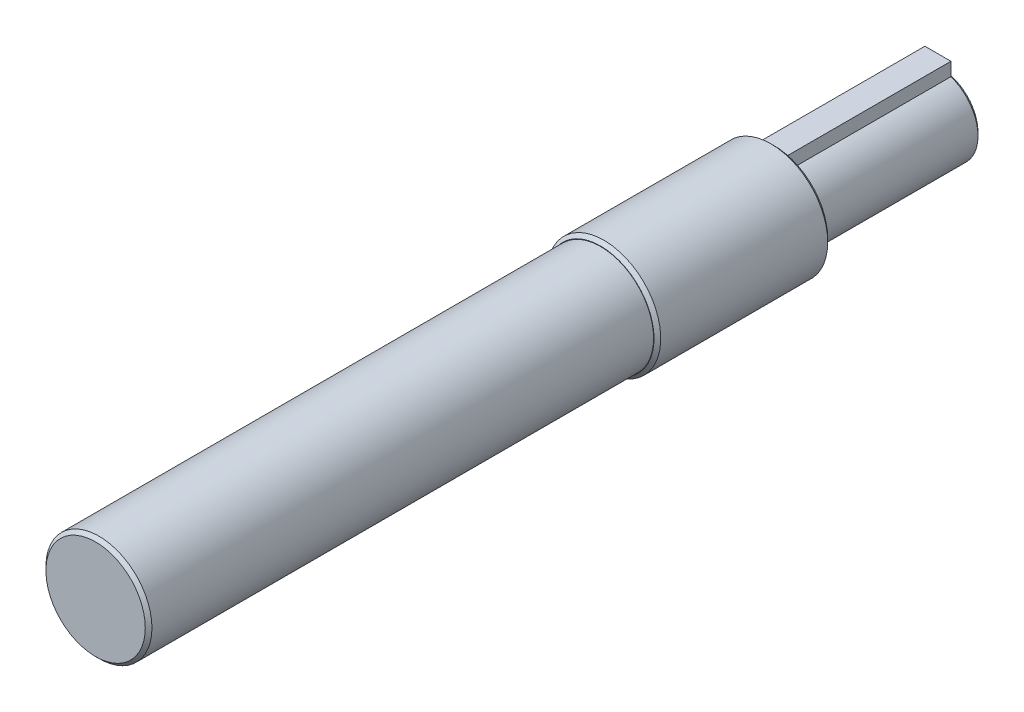
ISO-10303-21;
HEADER;
FILE_DESCRIPTION(('STEP AP214'),'2;1');
FILE_NAME('part.step','',(''),(''),'','','');
FILE_SCHEMA(('AUTOMOTIVE_DESIGN { 1 0 10303 214 1 1 1 1 }'));
ENDSEC;
DATA;
#1=APPLICATION_CONTEXT('core data for automotive mechanical design processes');
#2=APPLICATION_PROTOCOL_DEFINITION('international standard','automotive_design',2000,#1);
#3=PRODUCT_CONTEXT('',#1,'mechanical');
#4=PRODUCT('Part','Part','',(#3));
#5=PRODUCT_RELATED_PRODUCT_CATEGORY('part','',(#4));
#6=PRODUCT_DEFINITION_FORMATION('','',#4);
#7=PRODUCT_DEFINITION_CONTEXT('part definition',#1,'design');
#8=PRODUCT_DEFINITION('design','',#6,#7);
#9=PRODUCT_DEFINITION_SHAPE('','',#8);
#10=(LENGTH_UNIT() NAMED_UNIT(*) SI_UNIT(.MILLI.,.METRE.));
#11=(NAMED_UNIT(*) PLANE_ANGLE_UNIT() SI_UNIT($,.RADIAN.));
#12=(NAMED_UNIT(*) SI_UNIT($,.STERADIAN.) SOLID_ANGLE_UNIT());
#13=UNCERTAINTY_MEASURE_WITH_UNIT(LENGTH_MEASURE(1.E-05),#10,'distance_accuracy_value','');
#14=(GEOMETRIC_REPRESENTATION_CONTEXT(3) GLOBAL_UNCERTAINTY_ASSIGNED_CONTEXT((#13)) GLOBAL_UNIT_ASSIGNED_CONTEXT((#10,
#11,#12)) REPRESENTATION_CONTEXT('',''));
#15=CARTESIAN_POINT('',(0.,0.,0.));
#16=DIRECTION('',(0.,0.,1.));
#17=DIRECTION('',(1.,0.,0.));
#18=AXIS2_PLACEMENT_3D('',#15,#16,#17);
#19=CARTESIAN_POINT('',(0.,0.,0.));
#20=DIRECTION('',(0.,0.,1.));
#21=DIRECTION('',(1.,0.,0.));
#22=AXIS2_PLACEMENT_3D('',#19,#20,#21);
#23=PLANE('',#22);
#24=CARTESIAN_POINT('',(0.,0.,0.));
#25=DIRECTION('',(0.,0.,1.));
#26=DIRECTION('',(1.,0.,0.));
#27=AXIS2_PLACEMENT_3D('',#24,#25,#26);
#28=CIRCLE('',#27,7.99999999999992);
#29=CARTESIAN_POINT('',(7.99999999999992,0.,0.));
#30=VERTEX_POINT('',#29);
#31=EDGE_CURVE('E11',#30,#30,#28,.F.);
#32=ORIENTED_EDGE('',*,*,#31,.T.);
#33=EDGE_LOOP('',(#32));
#34=FACE_BOUND('',#33,.T.);
#35=DIRECTION('',(0.,1.,0.));
#36=VECTOR('',#35,1.);
#37=CARTESIAN_POINT('',(-1.95,7.67428409581332,0.));
#38=LINE('',#37,#36);
#39=CARTESIAN_POINT('',(-1.95,5.67428409581332,0.));
#40=VERTEX_POINT('',#39);
#41=CARTESIAN_POINT('',(-1.95,7.67428409581332,0.));
#42=VERTEX_POINT('',#41);
#43=EDGE_CURVE('E123',#40,#42,#38,.T.);
#44=ORIENTED_EDGE('',*,*,#43,.F.);
#45=CARTESIAN_POINT('',(0.,0.,0.));
#46=DIRECTION('',(0.,0.,1.));
#47=DIRECTION('',(1.,0.,0.));
#48=AXIS2_PLACEMENT_3D('',#45,#46,#47);
#49=CIRCLE('',#48,6.);
#50=CARTESIAN_POINT('',(1.95,5.67428409581332,0.));
#51=VERTEX_POINT('',#50);
#52=EDGE_CURVE('E118',#40,#51,#49,.T.);
#53=ORIENTED_EDGE('',*,*,#52,.T.);
#54=DIRECTION('',(0.,-1.,0.));
#55=VECTOR('',#54,1.);
#56=CARTESIAN_POINT('',(1.95,5.67428409581332,0.));
#57=LINE('',#56,#55);
#58=CARTESIAN_POINT('',(1.95,7.67428409581332,0.));
#59=VERTEX_POINT('',#58);
#60=EDGE_CURVE('E103',#59,#51,#57,.T.);
#61=ORIENTED_EDGE('',*,*,#60,.F.);
#62=DIRECTION('',(1.,0.,0.));
#63=VECTOR('',#62,1.);
#64=CARTESIAN_POINT('',(1.95,7.67428409581332,0.));
#65=LINE('',#64,#63);
#66=EDGE_CURVE('E115',#42,#59,#65,.T.);
#67=ORIENTED_EDGE('',*,*,#66,.F.);
#68=EDGE_LOOP('',(#44,#53,#61,#67));
#69=FACE_BOUND('',#68,.T.);
#70=ADVANCED_FACE('F41',(#34,#69),#23,.F.);
#71=CARTESIAN_POINT('',(0.,0.,26.));
#72=DIRECTION('',(0.,0.,-1.));
#73=DIRECTION('',(-1.,0.,0.));
#74=AXIS2_PLACEMENT_3D('',#71,#72,#73);
#75=CYLINDRICAL_SURFACE('',#74,8.5);
#76=CARTESIAN_POINT('',(0.,0.,25.5000000000001));
#77=DIRECTION('',(0.,0.,1.));
#78=DIRECTION('',(1.,0.,0.));
#79=AXIS2_PLACEMENT_3D('',#76,#77,#78);
#80=CIRCLE('',#79,8.5);
#81=CARTESIAN_POINT('',(-8.5,0.,25.5000000000001));
#82=VERTEX_POINT('',#81);
#83=EDGE_CURVE('E52',#82,#82,#80,.F.);
#84=CARTESIAN_POINT('',(0.,0.,0.500000000000077));
#85=DIRECTION('',(0.,0.,1.));
#86=DIRECTION('',(1.,0.,0.));
#87=AXIS2_PLACEMENT_3D('',#84,#85,#86);
#88=CIRCLE('',#87,8.5);
#89=CARTESIAN_POINT('',(-8.5,0.,0.500000000000077));
#90=VERTEX_POINT('',#89);
#91=EDGE_CURVE('E171',#90,#90,#88,.T.);
#92=CARTESIAN_POINT('',(-8.5,0.,25.5000000000001));
#93=CARTESIAN_POINT('',(-8.5,0.,25.2395833333334));
#94=CARTESIAN_POINT('',(-8.5,0.,24.9791666666667));
#95=CARTESIAN_POINT('',(-8.5,0.,24.4583333333334));
#96=CARTESIAN_POINT('',(-8.5,0.,24.1979166666667));
#97=CARTESIAN_POINT('',(-8.5,0.,23.6770833333334));
#98=CARTESIAN_POINT('',(-8.5,0.,23.4166666666667));
#99=CARTESIAN_POINT('',(-8.5,0.,22.8958333333334));
#100=CARTESIAN_POINT('',(-8.5,0.,22.6354166666667));
#101=CARTESIAN_POINT('',(-8.5,0.,22.1145833333334));
#102=CARTESIAN_POINT('',(-8.5,0.,21.8541666666667));
#103=CARTESIAN_POINT('',(-8.5,0.,21.3333333333334));
#104=CARTESIAN_POINT('',(-8.5,0.,21.0729166666667));
#105=CARTESIAN_POINT('',(-8.5,0.,20.5520833333334));
#106=CARTESIAN_POINT('',(-8.5,0.,20.2916666666667));
#107=CARTESIAN_POINT('',(-8.5,0.,19.7708333333334));
#108=CARTESIAN_POINT('',(-8.5,0.,19.5104166666667));
#109=CARTESIAN_POINT('',(-8.5,0.,18.9895833333334));
#110=CARTESIAN_POINT('',(-8.5,0.,18.7291666666667));
#111=CARTESIAN_POINT('',(-8.5,0.,18.2083333333334));
#112=CARTESIAN_POINT('',(-8.5,0.,17.9479166666667));
#113=CARTESIAN_POINT('',(-8.5,0.,17.4270833333334));
#114=CARTESIAN_POINT('',(-8.5,0.,17.1666666666667));
#115=CARTESIAN_POINT('',(-8.5,0.,16.6458333333334));
#116=CARTESIAN_POINT('',(-8.5,0.,16.3854166666667));
#117=CARTESIAN_POINT('',(-8.5,0.,15.8645833333334));
#118=CARTESIAN_POINT('',(-8.5,0.,15.6041666666667));
#119=CARTESIAN_POINT('',(-8.5,0.,15.0833333333334));
#120=CARTESIAN_POINT('',(-8.5,0.,14.8229166666667));
#121=CARTESIAN_POINT('',(-8.5,0.,14.3020833333334));
#122=CARTESIAN_POINT('',(-8.5,0.,14.0416666666667));
#123=CARTESIAN_POINT('',(-8.5,0.,13.5208333333334));
#124=CARTESIAN_POINT('',(-8.5,0.,13.2604166666667));
#125=CARTESIAN_POINT('',(-8.5,0.,12.7395833333334));
#126=CARTESIAN_POINT('',(-8.5,0.,12.4791666666667));
#127=CARTESIAN_POINT('',(-8.5,0.,11.9583333333334));
#128=CARTESIAN_POINT('',(-8.5,0.,11.6979166666667));
#129=CARTESIAN_POINT('',(-8.5,0.,11.1770833333334));
#130=CARTESIAN_POINT('',(-8.5,0.,10.9166666666667));
#131=CARTESIAN_POINT('',(-8.5,0.,10.3958333333334));
#132=CARTESIAN_POINT('',(-8.5,0.,10.1354166666667));
#133=CARTESIAN_POINT('',(-8.5,0.,9.61458333333341));
#134=CARTESIAN_POINT('',(-8.5,0.,9.35416666666674));
#135=CARTESIAN_POINT('',(-8.5,0.,8.83333333333341));
#136=CARTESIAN_POINT('',(-8.5,0.,8.57291666666674));
#137=CARTESIAN_POINT('',(-8.5,0.,8.05208333333341));
#138=CARTESIAN_POINT('',(-8.5,0.,7.79166666666674));
#139=CARTESIAN_POINT('',(-8.5,0.,7.27083333333341));
#140=CARTESIAN_POINT('',(-8.5,0.,7.01041666666674));
#141=CARTESIAN_POINT('',(-8.5,0.,6.48958333333341));
#142=CARTESIAN_POINT('',(-8.5,0.,6.22916666666674));
#143=CARTESIAN_POINT('',(-8.5,0.,5.70833333333341));
#144=CARTESIAN_POINT('',(-8.5,0.,5.44791666666674));
#145=CARTESIAN_POINT('',(-8.5,0.,4.92708333333341));
#146=CARTESIAN_POINT('',(-8.5,0.,4.66666666666674));
#147=CARTESIAN_POINT('',(-8.5,0.,4.14583333333341));
#148=CARTESIAN_POINT('',(-8.5,0.,3.88541666666674));
#149=CARTESIAN_POINT('',(-8.5,0.,3.36458333333341));
#150=CARTESIAN_POINT('',(-8.5,0.,3.10416666666674));
#151=CARTESIAN_POINT('',(-8.5,0.,2.58333333333341));
#152=CARTESIAN_POINT('',(-8.5,0.,2.32291666666674));
#153=CARTESIAN_POINT('',(-8.5,0.,1.80208333333341));
#154=CARTESIAN_POINT('',(-8.5,0.,1.54166666666674));
#155=CARTESIAN_POINT('',(-8.5,0.,1.02083333333341));
#156=CARTESIAN_POINT('',(-8.5,0.,0.760416666666744));
#157=CARTESIAN_POINT('',(-8.5,0.,0.500000000000077));
#158=B_SPLINE_CURVE_WITH_KNOTS('',3,(#92,#93,#94,#95,#96,#97,#98,#99,#100,#101,#102,#103,#104,
#105,#106,#107,#108,#109,#110,#111,#112,#113,#114,#115,#116,#117,#118,#119,#120,#121,#122,#123,
#124,#125,#126,#127,#128,#129,#130,#131,#132,#133,#134,#135,#136,#137,#138,#139,#140,#141,#142,
#143,#144,#145,#146,#147,#148,#149,#150,#151,#152,#153,#154,#155,#156,#157),.UNSPECIFIED.,.F.,
.F.,(4,2,2,2,2,2,2,2,2,2,2,2,2,2,2,2,2,2,2,2,2,2,2,2,2,2,2,2,2,2,2,2,4),(0.,0.781249999999997,
1.5625,2.34375,3.125,3.90625,4.6875,5.46875,6.25,7.03125,7.8125,8.59374999999999,
9.37499999999999,10.15625,10.9375,11.71875,12.5,13.28125,14.0625,14.84375,15.625,16.40625,
17.1875,17.96875,18.75,19.53125,20.3125,21.09375,21.875,22.65625,23.4375,24.21875,25.),.UNSPECIFIED.);
#159=EDGE_CURVE('BSEAM241',#82,#90,#158,.T.);
#160=ORIENTED_EDGE('',*,*,#83,.T.);
#161=ORIENTED_EDGE('',*,*,#91,.T.);
#162=ORIENTED_EDGE('',*,*,#159,.T.);
#163=ORIENTED_EDGE('',*,*,#159,.F.);
#164=EDGE_LOOP('',(#160,#162,#161,#163));
#165=FACE_BOUND('',#164,.T.);
#166=ADVANCED_FACE('F241',(#165),#75,.T.);
#167=CARTESIAN_POINT('',(0.,0.,26.));
#168=DIRECTION('',(0.,0.,1.));
#169=DIRECTION('',(1.,0.,0.));
#170=AXIS2_PLACEMENT_3D('',#167,#168,#169);
#171=PLANE('',#170);
#172=CARTESIAN_POINT('',(0.,0.,26.));
#173=DIRECTION('',(0.,0.,1.));
#174=DIRECTION('',(1.,0.,0.));
#175=AXIS2_PLACEMENT_3D('',#172,#173,#174);
#176=CIRCLE('',#175,8.00000000000007);
#177=CARTESIAN_POINT('',(8.00000000000007,0.,26.));
#178=VERTEX_POINT('',#177);
#179=EDGE_CURVE('E167',#178,#178,#176,.T.);
#180=ORIENTED_EDGE('',*,*,#179,.T.);
#181=EDGE_LOOP('',(#180));
#182=FACE_BOUND('',#181,.T.);
#183=CARTESIAN_POINT('',(0.,0.,26.));
#184=DIRECTION('',(0.,0.,1.));
#185=DIRECTION('',(1.,0.,0.));
#186=AXIS2_PLACEMENT_3D('',#183,#184,#185);
#187=CIRCLE('',#186,7.9375);
#188=CARTESIAN_POINT('',(7.9375,0.,26.));
#189=VERTEX_POINT('',#188);
#190=EDGE_CURVE('E136',#189,#189,#187,.T.);
#191=ORIENTED_EDGE('',*,*,#190,.F.);
#192=EDGE_LOOP('',(#191));
#193=FACE_BOUND('',#192,.T.);
#194=ADVANCED_FACE('F238',(#182,#193),#171,.T.);
#195=CARTESIAN_POINT('',(0.,0.,25.4));
#196=DIRECTION('',(0.,0.,-1.));
#197=DIRECTION('',(-1.,0.,0.));
#198=AXIS2_PLACEMENT_3D('',#195,#196,#197);
#199=CYLINDRICAL_SURFACE('',#198,6.);
#200=DIRECTION('',(0.,0.,1.));
#201=VECTOR('',#200,1.);
#202=CARTESIAN_POINT('',(-1.95,5.67428409581332,-25.));
#203=LINE('',#202,#201);
#204=CARTESIAN_POINT('',(-1.95,5.67428409581332,-24.5));
#205=VERTEX_POINT('',#204);
#206=EDGE_CURVE('E133',#205,#40,#203,.T.);
#207=ORIENTED_EDGE('',*,*,#206,.F.);
#208=CARTESIAN_POINT('',(0.,0.,-24.5));
#209=DIRECTION('',(0.,0.,-1.));
#210=DIRECTION('',(-1.,0.,0.));
#211=AXIS2_PLACEMENT_3D('',#208,#209,#210);
#212=CIRCLE('',#211,6.);
#213=CARTESIAN_POINT('',(1.95,5.67428409581332,-24.5));
#214=VERTEX_POINT('',#213);
#215=EDGE_CURVE('E164',#205,#214,#212,.F.);
#216=ORIENTED_EDGE('',*,*,#215,.T.);
#217=DIRECTION('',(0.,0.,1.));
#218=VECTOR('',#217,1.);
#219=CARTESIAN_POINT('',(1.95,5.67428409581332,-25.));
#220=LINE('',#219,#218);
#221=EDGE_CURVE('E109',#214,#51,#220,.T.);
#222=ORIENTED_EDGE('',*,*,#221,.T.);
#223=ORIENTED_EDGE('',*,*,#52,.F.);
#224=EDGE_LOOP('',(#207,#216,#222,#223));
#225=FACE_BOUND('',#224,.T.);
#226=ADVANCED_FACE('F229',(#225),#199,.T.);
#227=CARTESIAN_POINT('',(-1.95,7.67428409581332,-25.));
#228=DIRECTION('',(1.,0.,0.));
#229=DIRECTION('',(0.,0.,-1.));
#230=AXIS2_PLACEMENT_3D('',#227,#228,#229);
#231=PLANE('',#230);
#232=DIRECTION('',(0.,0.,1.));
#233=VECTOR('',#232,1.);
#234=CARTESIAN_POINT('',(-1.95,7.67428409581332,-25.));
#235=LINE('',#234,#233);
#236=CARTESIAN_POINT('',(-1.95,7.67428409581332,-24.5));
#237=VERTEX_POINT('',#236);
#238=EDGE_CURVE('E108',#237,#42,#235,.T.);
#239=ORIENTED_EDGE('',*,*,#238,.F.);
#240=DIRECTION('',(0.,-1.,0.));
#241=VECTOR('',#240,1.);
#242=CARTESIAN_POINT('',(-1.95,5.67428409581332,-24.5));
#243=LINE('',#242,#241);
#244=EDGE_CURVE('E60',#237,#205,#243,.T.);
#245=ORIENTED_EDGE('',*,*,#244,.T.);
#246=ORIENTED_EDGE('',*,*,#206,.T.);
#247=ORIENTED_EDGE('',*,*,#43,.T.);
#248=EDGE_LOOP('',(#239,#245,#246,#247));
#249=FACE_BOUND('',#248,.T.);
#250=ADVANCED_FACE('F230',(#249),#231,.F.);
#251=CARTESIAN_POINT('',(1.95,7.67428409581332,-25.));
#252=DIRECTION('',(0.,-1.,0.));
#253=DIRECTION('',(0.,0.,-1.));
#254=AXIS2_PLACEMENT_3D('',#251,#252,#253);
#255=PLANE('',#254);
#256=DIRECTION('',(0.,0.,1.));
#257=VECTOR('',#256,1.);
#258=CARTESIAN_POINT('',(1.95,7.67428409581332,-25.));
#259=LINE('',#258,#257);
#260=CARTESIAN_POINT('',(1.95,7.67428409581332,-24.5));
#261=VERTEX_POINT('',#260);
#262=EDGE_CURVE('E99',#261,#59,#259,.T.);
#263=ORIENTED_EDGE('',*,*,#262,.F.);
#264=DIRECTION('',(-1.,0.,0.));
#265=VECTOR('',#264,1.);
#266=CARTESIAN_POINT('',(-1.95,7.67428409581332,-24.5));
#267=LINE('',#266,#265);
#268=EDGE_CURVE('E68',#261,#237,#267,.T.);
#269=ORIENTED_EDGE('',*,*,#268,.T.);
#270=ORIENTED_EDGE('',*,*,#238,.T.);
#271=ORIENTED_EDGE('',*,*,#66,.T.);
#272=EDGE_LOOP('',(#263,#269,#270,#271));
#273=FACE_BOUND('',#272,.T.);
#274=ADVANCED_FACE('F121',(#273),#255,.F.);
#275=CARTESIAN_POINT('',(1.95,5.67428409581332,-25.));
#276=DIRECTION('',(-1.,0.,0.));
#277=DIRECTION('',(0.,0.,1.));
#278=AXIS2_PLACEMENT_3D('',#275,#276,#277);
#279=PLANE('',#278);
#280=ORIENTED_EDGE('',*,*,#221,.F.);
#281=DIRECTION('',(0.,1.,0.));
#282=VECTOR('',#281,1.);
#283=CARTESIAN_POINT('',(1.95,7.67428409581332,-24.5));
#284=LINE('',#283,#282);
#285=EDGE_CURVE('E105',#214,#261,#284,.T.);
#286=ORIENTED_EDGE('',*,*,#285,.T.);
#287=ORIENTED_EDGE('',*,*,#262,.T.);
#288=ORIENTED_EDGE('',*,*,#60,.T.);
#289=EDGE_LOOP('',(#280,#286,#287,#288));
#290=FACE_BOUND('',#289,.T.);
#291=ADVANCED_FACE('F102',(#290),#279,.F.);
#292=CARTESIAN_POINT('',(0.,0.,-25.));
#293=DIRECTION('',(0.,0.,-1.));
#294=DIRECTION('',(-1.,0.,0.));
#295=AXIS2_PLACEMENT_3D('',#292,#293,#294);
#296=PLANE('',#295);
#297=DIRECTION('',(1.,0.,0.));
#298=VECTOR('',#297,1.);
#299=CARTESIAN_POINT('',(1.95,7.17428409581333,-25.));
#300=LINE('',#299,#298);
#301=CARTESIAN_POINT('',(-1.45,7.17428409581333,-25.));
#302=VERTEX_POINT('',#301);
#303=CARTESIAN_POINT('',(1.45,7.17428409581333,-25.));
#304=VERTEX_POINT('',#303);
#305=EDGE_CURVE('E151',#302,#304,#300,.T.);
#306=ORIENTED_EDGE('',*,*,#305,.T.);
#307=DIRECTION('',(0.,-1.,0.));
#308=VECTOR('',#307,1.);
#309=CARTESIAN_POINT('',(1.45,5.67428409581332,-25.));
#310=LINE('',#309,#308);
#311=CARTESIAN_POINT('',(1.45,5.30542175514822,-25.));
#312=VERTEX_POINT('',#311);
#313=EDGE_CURVE('E154',#304,#312,#310,.T.);
#314=ORIENTED_EDGE('',*,*,#313,.T.);
#315=CARTESIAN_POINT('',(0.,0.,-25.));
#316=DIRECTION('',(0.,0.,-1.));
#317=DIRECTION('',(-1.,0.,0.));
#318=AXIS2_PLACEMENT_3D('',#315,#316,#317);
#319=CIRCLE('',#318,5.50000000000001);
#320=CARTESIAN_POINT('',(-1.45,5.30542175514822,-25.));
#321=VERTEX_POINT('',#320);
#322=EDGE_CURVE('E145',#312,#321,#319,.T.);
#323=ORIENTED_EDGE('',*,*,#322,.T.);
#324=DIRECTION('',(0.,1.,0.));
#325=VECTOR('',#324,1.);
#326=CARTESIAN_POINT('',(-1.45,7.67428409581332,-25.));
#327=LINE('',#326,#325);
#328=EDGE_CURVE('E148',#321,#302,#327,.T.);
#329=ORIENTED_EDGE('',*,*,#328,.T.);
#330=EDGE_LOOP('',(#306,#314,#323,#329));
#331=FACE_BOUND('',#330,.T.);
#332=ADVANCED_FACE('F252',(#331),#296,.T.);
#333=CARTESIAN_POINT('',(0.,0.,101.6));
#334=DIRECTION('',(0.,0.,-1.));
#335=DIRECTION('',(-1.,0.,0.));
#336=AXIS2_PLACEMENT_3D('',#333,#334,#335);
#337=CYLINDRICAL_SURFACE('',#336,7.9375);
#338=CARTESIAN_POINT('',(0.,0.,101.1));
#339=DIRECTION('',(0.,0.,1.));
#340=DIRECTION('',(1.,0.,0.));
#341=AXIS2_PLACEMENT_3D('',#338,#339,#340);
#342=CIRCLE('',#341,7.9375);
#343=CARTESIAN_POINT('',(7.9375,0.,101.1));
#344=VERTEX_POINT('',#343);
#345=EDGE_CURVE('E141',#344,#344,#342,.F.);
#346=ORIENTED_EDGE('',*,*,#345,.T.);
#347=EDGE_LOOP('',(#346));
#348=FACE_BOUND('',#347,.T.);
#349=ORIENTED_EDGE('',*,*,#190,.T.);
#350=EDGE_LOOP('',(#349));
#351=FACE_BOUND('',#350,.T.);
#352=ADVANCED_FACE('F255',(#348,#351),#337,.T.);
#353=CARTESIAN_POINT('',(0.,0.,101.6));
#354=DIRECTION('',(0.,0.,1.));
#355=DIRECTION('',(1.,0.,0.));
#356=AXIS2_PLACEMENT_3D('',#353,#354,#355);
#357=PLANE('',#356);
#358=CARTESIAN_POINT('',(0.,0.,101.6));
#359=DIRECTION('',(0.,0.,1.));
#360=DIRECTION('',(1.,0.,0.));
#361=AXIS2_PLACEMENT_3D('',#358,#359,#360);
#362=CIRCLE('',#361,7.4375);
#363=CARTESIAN_POINT('',(7.4375,0.,101.6));
#364=VERTEX_POINT('',#363);
#365=EDGE_CURVE('E137',#364,#364,#362,.T.);
#366=ORIENTED_EDGE('',*,*,#365,.T.);
#367=EDGE_LOOP('',(#366));
#368=FACE_BOUND('',#367,.T.);
#369=ADVANCED_FACE('F272',(#368),#357,.T.);
#370=CARTESIAN_POINT('',(0.,0.,101.6));
#371=DIRECTION('',(0.,0.,-1.));
#372=DIRECTION('',(-1.,0.,0.));
#373=AXIS2_PLACEMENT_3D('',#370,#371,#372);
#374=CONICAL_SURFACE('',#373,7.4375,0.785398163397448);
#375=ORIENTED_EDGE('',*,*,#345,.F.);
#376=EDGE_LOOP('',(#375));
#377=FACE_BOUND('',#376,.T.);
#378=ORIENTED_EDGE('',*,*,#365,.F.);
#379=EDGE_LOOP('',(#378));
#380=FACE_BOUND('',#379,.T.);
#381=ADVANCED_FACE('F279',(#377,#380),#374,.T.);
#382=CARTESIAN_POINT('',(-1.45,0.,-25.));
#383=DIRECTION('',(-0.707106781186553,0.,-0.707106781186542));
#384=DIRECTION('',(0.,-1.,0.));
#385=AXIS2_PLACEMENT_3D('',#382,#383,#384);
#386=PLANE('',#385);
#387=CARTESIAN_POINT('',(-1.95,5.67428409581332,-24.5));
#388=CARTESIAN_POINT('',(-1.90804327183286,5.6443374440064,-24.5419567281671));
#389=CARTESIAN_POINT('',(-1.86615379292389,5.61420209570535,-24.5838462070761));
#390=CARTESIAN_POINT('',(-1.78251877585006,5.55354143712451,-24.6674812241499));
#391=CARTESIAN_POINT('',(-1.74077323095155,5.52301614541059,-24.7092267690485));
#392=CARTESIAN_POINT('',(-1.65743133116161,5.46156003695684,-24.7925686688384));
#393=CARTESIAN_POINT('',(-1.61583497702692,5.43062921816377,-24.8341650229731));
#394=CARTESIAN_POINT('',(-1.53279805579338,5.368345507828,-24.9172019442066));
#395=CARTESIAN_POINT('',(-1.49135749617879,5.33699259633152,-24.9586425038212));
#396=CARTESIAN_POINT('',(-1.44999999999995,5.30542175514839,-25.0000000000001));
#397=B_SPLINE_CURVE_WITH_KNOTS('',3,(#387,#388,#389,#390,#391,#392,#393,#394,#395,#396),
.UNSPECIFIED.,.F.,.F.,(4,2,2,2,4),(0.,0.199393472285525,0.398777486226476,0.598162510065842,
0.797556992854147),.UNSPECIFIED.);
#398=EDGE_CURVE('E206',#205,#321,#397,.T.);
#399=ORIENTED_EDGE('',*,*,#398,.F.);
#400=ORIENTED_EDGE('',*,*,#244,.F.);
#401=DIRECTION('',(0.577350269189623,-0.577350269189623,-0.577350269189632));
#402=VECTOR('',#401,1.);
#403=CARTESIAN_POINT('',(0.941428031937746,4.78285606387558,-27.3914280319378));
#404=LINE('',#403,#402);
#405=EDGE_CURVE('E46',#302,#237,#404,.F.);
#406=ORIENTED_EDGE('',*,*,#405,.F.);
#407=ORIENTED_EDGE('',*,*,#328,.F.);
#408=EDGE_LOOP('',(#399,#400,#406,#407));
#409=FACE_BOUND('',#408,.T.);
#410=ADVANCED_FACE('F202',(#409),#386,.T.);
#411=CARTESIAN_POINT('',(0.,7.17428409581333,-25.));
#412=DIRECTION('',(0.,0.707106781186553,-0.707106781186542));
#413=DIRECTION('',(-1.,0.,0.));
#414=AXIS2_PLACEMENT_3D('',#411,#412,#413);
#415=PLANE('',#414);
#416=ORIENTED_EDGE('',*,*,#405,.T.);
#417=ORIENTED_EDGE('',*,*,#268,.F.);
#418=DIRECTION('',(-0.577350269189623,-0.577350269189623,-0.577350269189632));
#419=VECTOR('',#418,1.);
#420=CARTESIAN_POINT('',(0.966666666666674,6.69095076248,-25.4833333333333));
#421=LINE('',#420,#419);
#422=EDGE_CURVE('E187',#304,#261,#421,.F.);
#423=ORIENTED_EDGE('',*,*,#422,.F.);
#424=ORIENTED_EDGE('',*,*,#305,.F.);
#425=EDGE_LOOP('',(#416,#417,#423,#424));
#426=FACE_BOUND('',#425,.T.);
#427=ADVANCED_FACE('F200',(#426),#415,.T.);
#428=CARTESIAN_POINT('',(0.,0.,-25.));
#429=DIRECTION('',(0.,0.,1.));
#430=DIRECTION('',(1.,0.,0.));
#431=AXIS2_PLACEMENT_3D('',#428,#429,#430);
#432=CONICAL_SURFACE('',#431,5.50000000000001,0.785398163397444);
#433=ORIENTED_EDGE('',*,*,#398,.T.);
#434=ORIENTED_EDGE('',*,*,#322,.F.);
#435=CARTESIAN_POINT('',(1.45,5.30542175514823,-25.));
#436=CARTESIAN_POINT('',(1.49135749617881,5.33699259633145,-24.9586425038212));
#437=CARTESIAN_POINT('',(1.53279805579338,5.36834550782798,-24.9172019442066));
#438=CARTESIAN_POINT('',(1.6158349770269,5.43062921816379,-24.8341650229731));
#439=CARTESIAN_POINT('',(1.6574313311616,5.46156003695685,-24.7925686688384));
#440=CARTESIAN_POINT('',(1.74077323095155,5.52301614541057,-24.7092267690485));
#441=CARTESIAN_POINT('',(1.78251877585007,5.55354143712447,-24.6674812241499));
#442=CARTESIAN_POINT('',(1.86615379292387,5.61420209570539,-24.5838462070761));
#443=CARTESIAN_POINT('',(1.90804327183281,5.64433744400652,-24.5419567281672));
#444=CARTESIAN_POINT('',(1.94999999999987,5.67428409581366,-24.5000000000001));
#445=B_SPLINE_CURVE_WITH_KNOTS('',3,(#435,#436,#437,#438,#439,#440,#441,#442,#443,#444),
.UNSPECIFIED.,.F.,.F.,(4,2,2,2,4),(0.,0.199394482788305,0.398779506627671,0.598163520568618,
0.797556992854144),.UNSPECIFIED.);
#446=EDGE_CURVE('E178',#214,#312,#445,.F.);
#447=ORIENTED_EDGE('',*,*,#446,.F.);
#448=ORIENTED_EDGE('',*,*,#215,.F.);
#449=EDGE_LOOP('',(#433,#434,#447,#448));
#450=FACE_BOUND('',#449,.T.);
#451=ADVANCED_FACE('F193',(#450),#432,.T.);
#452=CARTESIAN_POINT('',(1.45,0.,-25.));
#453=DIRECTION('',(0.707106781186553,0.,-0.707106781186542));
#454=DIRECTION('',(0.,1.,0.));
#455=AXIS2_PLACEMENT_3D('',#452,#453,#454);
#456=PLANE('',#455);
#457=ORIENTED_EDGE('',*,*,#422,.T.);
#458=ORIENTED_EDGE('',*,*,#285,.F.);
#459=ORIENTED_EDGE('',*,*,#446,.T.);
#460=ORIENTED_EDGE('',*,*,#313,.F.);
#461=EDGE_LOOP('',(#457,#458,#459,#460));
#462=FACE_BOUND('',#461,.T.);
#463=ADVANCED_FACE('F189',(#462),#456,.T.);
#464=CARTESIAN_POINT('',(0.,0.,26.));
#465=DIRECTION('',(0.,0.,-1.));
#466=DIRECTION('',(-1.,0.,0.));
#467=AXIS2_PLACEMENT_3D('',#464,#465,#466);
#468=CONICAL_SURFACE('',#467,8.00000000000007,0.785398163397447);
#469=ORIENTED_EDGE('',*,*,#83,.F.);
#470=EDGE_LOOP('',(#469));
#471=FACE_BOUND('',#470,.T.);
#472=ORIENTED_EDGE('',*,*,#179,.F.);
#473=EDGE_LOOP('',(#472));
#474=FACE_BOUND('',#473,.T.);
#475=ADVANCED_FACE('F307',(#471,#474),#468,.T.);
#476=CARTESIAN_POINT('',(0.,0.,0.500000000000077));
#477=DIRECTION('',(0.,0.,1.));
#478=DIRECTION('',(1.,0.,0.));
#479=AXIS2_PLACEMENT_3D('',#476,#477,#478);
#480=CONICAL_SURFACE('',#479,8.5,0.78539816339745);
#481=ORIENTED_EDGE('',*,*,#31,.F.);
#482=EDGE_LOOP('',(#481));
#483=FACE_BOUND('',#482,.T.);
#484=ORIENTED_EDGE('',*,*,#91,.F.);
#485=EDGE_LOOP('',(#484));
#486=FACE_BOUND('',#485,.T.);
#487=ADVANCED_FACE('F44',(#483,#486),#480,.T.);
#488=CLOSED_SHELL('',(#70,#166,#194,#226,#250,#274,#291,#332,#352,#369,#381,#410,#427,#451,#463,
#475,#487));
#489=MANIFOLD_SOLID_BREP('B2',#488);
#490=ADVANCED_BREP_SHAPE_REPRESENTATION('',(#18,#489),#14);
#491=SHAPE_DEFINITION_REPRESENTATION(#9,#490);
ENDSEC;
END-ISO-10303-21;
